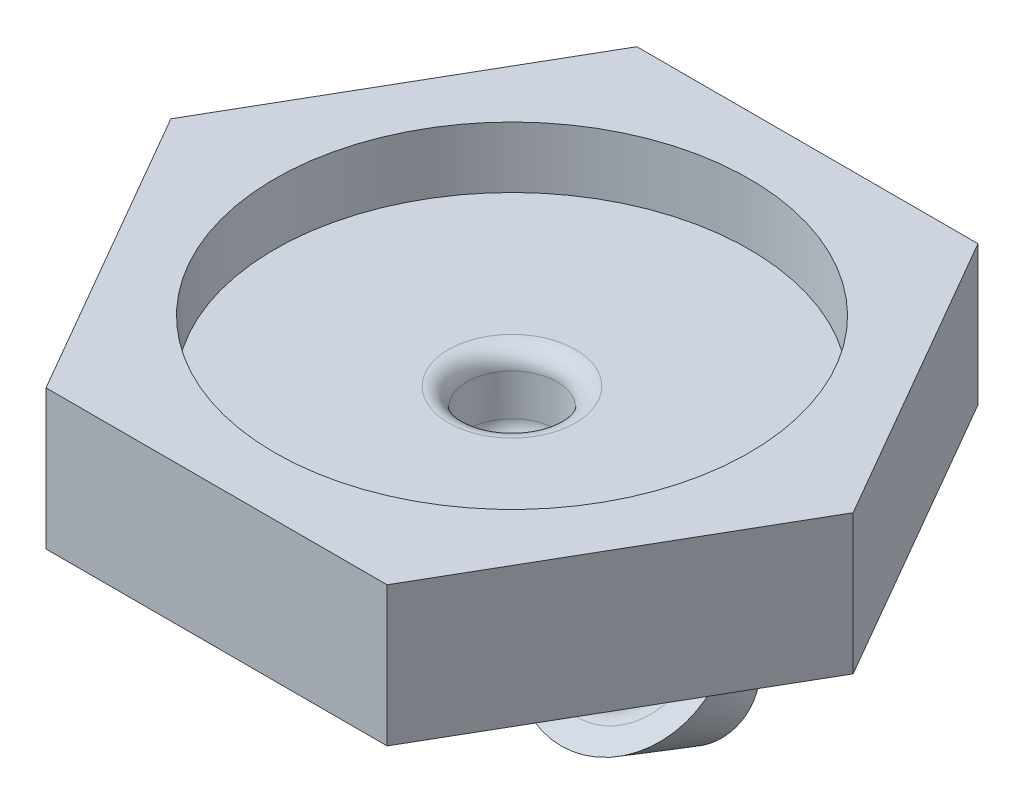
ISO-10303-21;
HEADER;
FILE_DESCRIPTION(('STEP AP214'),'2;1');
FILE_NAME('part.step','',(''),(''),'','','');
FILE_SCHEMA(('AUTOMOTIVE_DESIGN { 1 0 10303 214 1 1 1 1 }'));
ENDSEC;
DATA;
#1=APPLICATION_CONTEXT('core data for automotive mechanical design processes');
#2=APPLICATION_PROTOCOL_DEFINITION('international standard','automotive_design',2000,#1);
#3=PRODUCT_CONTEXT('',#1,'mechanical');
#4=PRODUCT('Part','Part','',(#3));
#5=PRODUCT_RELATED_PRODUCT_CATEGORY('part','',(#4));
#6=PRODUCT_DEFINITION_FORMATION('','',#4);
#7=PRODUCT_DEFINITION_CONTEXT('part definition',#1,'design');
#8=PRODUCT_DEFINITION('design','',#6,#7);
#9=PRODUCT_DEFINITION_SHAPE('','',#8);
#10=(LENGTH_UNIT() NAMED_UNIT(*) SI_UNIT(.MILLI.,.METRE.));
#11=(NAMED_UNIT(*) PLANE_ANGLE_UNIT() SI_UNIT($,.RADIAN.));
#12=(NAMED_UNIT(*) SI_UNIT($,.STERADIAN.) SOLID_ANGLE_UNIT());
#13=UNCERTAINTY_MEASURE_WITH_UNIT(LENGTH_MEASURE(1.E-05),#10,'distance_accuracy_value','');
#14=(GEOMETRIC_REPRESENTATION_CONTEXT(3) GLOBAL_UNCERTAINTY_ASSIGNED_CONTEXT((#13)) GLOBAL_UNIT_ASSIGNED_CONTEXT((#10,
#11,#12)) REPRESENTATION_CONTEXT('',''));
#15=CARTESIAN_POINT('',(0.,0.,0.));
#16=DIRECTION('',(0.,0.,1.));
#17=DIRECTION('',(1.,0.,0.));
#18=AXIS2_PLACEMENT_3D('',#15,#16,#17);
#19=CARTESIAN_POINT('',(0.,3.22,0.));
#20=DIRECTION('',(0.,1.,0.));
#21=DIRECTION('',(0.,0.,1.));
#22=AXIS2_PLACEMENT_3D('',#19,#20,#21);
#23=TOROIDAL_SURFACE('',#22,3.415,1.);
#24=CARTESIAN_POINT('',(0.,4.22,0.));
#25=DIRECTION('',(0.,1.,0.));
#26=DIRECTION('',(0.,0.,1.));
#27=AXIS2_PLACEMENT_3D('',#24,#25,#26);
#28=CIRCLE('',#27,3.415);
#29=CARTESIAN_POINT('',(0.,4.22,3.415));
#30=VERTEX_POINT('',#29);
#31=EDGE_CURVE('E48',#30,#30,#28,.F.);
#32=ORIENTED_EDGE('',*,*,#31,.F.);
#33=EDGE_LOOP('',(#32));
#34=FACE_BOUND('',#33,.T.);
#35=CARTESIAN_POINT('',(0.,3.22,0.));
#36=DIRECTION('',(0.,1.,0.));
#37=DIRECTION('',(0.,0.,1.));
#38=AXIS2_PLACEMENT_3D('',#35,#36,#37);
#39=CIRCLE('',#38,2.415);
#40=CARTESIAN_POINT('',(0.,3.22,2.415));
#41=VERTEX_POINT('',#40);
#42=EDGE_CURVE('E11',#41,#41,#39,.T.);
#43=ORIENTED_EDGE('',*,*,#42,.F.);
#44=EDGE_LOOP('',(#43));
#45=FACE_BOUND('',#44,.T.);
#46=ADVANCED_FACE('F39',(#34,#45),#23,.T.);
#47=CARTESIAN_POINT('',(0.,1.,0.));
#48=DIRECTION('',(0.,-1.,0.));
#49=DIRECTION('',(0.,0.,-1.));
#50=AXIS2_PLACEMENT_3D('',#47,#48,#49);
#51=TOROIDAL_SURFACE('',#50,1.415,1.);
#52=CARTESIAN_POINT('',(0.,1.,0.));
#53=DIRECTION('',(0.,-1.,0.));
#54=DIRECTION('',(0.,0.,-1.));
#55=AXIS2_PLACEMENT_3D('',#52,#53,#54);
#56=CIRCLE('',#55,2.415);
#57=CARTESIAN_POINT('',(0.,1.,-2.415));
#58=VERTEX_POINT('',#57);
#59=EDGE_CURVE('E172',#58,#58,#56,.T.);
#60=ORIENTED_EDGE('',*,*,#59,.F.);
#61=EDGE_LOOP('',(#60));
#62=FACE_BOUND('',#61,.T.);
#63=CARTESIAN_POINT('',(0.,0.,0.));
#64=DIRECTION('',(0.,-1.,0.));
#65=DIRECTION('',(0.,0.,-1.));
#66=AXIS2_PLACEMENT_3D('',#63,#64,#65);
#67=CIRCLE('',#66,1.415);
#68=CARTESIAN_POINT('',(0.,0.,-1.415));
#69=VERTEX_POINT('',#68);
#70=EDGE_CURVE('E176',#69,#69,#67,.F.);
#71=ORIENTED_EDGE('',*,*,#70,.F.);
#72=EDGE_LOOP('',(#71));
#73=FACE_BOUND('',#72,.T.);
#74=ADVANCED_FACE('F188',(#62,#73),#51,.F.);
#75=CARTESIAN_POINT('',(0.,-9.77817459305202,-5.29289321881346));
#76=DIRECTION('',(0.,0.707106781186546,0.707106781186549));
#77=DIRECTION('',(0.,-0.707106781186549,0.707106781186546));
#78=AXIS2_PLACEMENT_3D('',#75,#76,#77);
#79=TOROIDAL_SURFACE('',#78,3.5,1.);
#80=CARTESIAN_POINT('',(0.,-10.4852813742386,-6.00000000000001));
#81=DIRECTION('',(0.,0.707106781186546,0.707106781186549));
#82=DIRECTION('',(0.,-0.707106781186549,0.707106781186546));
#83=AXIS2_PLACEMENT_3D('',#80,#81,#82);
#84=CIRCLE('',#83,3.5);
#85=CARTESIAN_POINT('',(0.,-12.9601551083915,-3.5251262658471));
#86=VERTEX_POINT('',#85);
#87=EDGE_CURVE('E164',#86,#86,#84,.F.);
#88=ORIENTED_EDGE('',*,*,#87,.F.);
#89=EDGE_LOOP('',(#88));
#90=FACE_BOUND('',#89,.T.);
#91=CARTESIAN_POINT('',(0.,-9.77817459305202,-5.29289321881346));
#92=DIRECTION('',(0.,0.707106781186546,0.707106781186549));
#93=DIRECTION('',(0.,-0.707106781186549,0.707106781186546));
#94=AXIS2_PLACEMENT_3D('',#91,#92,#93);
#95=CIRCLE('',#94,2.5);
#96=CARTESIAN_POINT('',(0.,-11.5459415460184,-3.5251262658471));
#97=VERTEX_POINT('',#96);
#98=EDGE_CURVE('E168',#97,#97,#95,.T.);
#99=ORIENTED_EDGE('',*,*,#98,.F.);
#100=EDGE_LOOP('',(#99));
#101=FACE_BOUND('',#100,.T.);
#102=ADVANCED_FACE('F200',(#90,#101),#79,.F.);
#103=CARTESIAN_POINT('',(0.,-2.,0.));
#104=DIRECTION('',(0.,1.,0.));
#105=DIRECTION('',(0.,0.,1.));
#106=AXIS2_PLACEMENT_3D('',#103,#104,#105);
#107=TOROIDAL_SURFACE('',#106,4.5,2.);
#108=CARTESIAN_POINT('',(0.,0.,0.));
#109=DIRECTION('',(0.,1.,0.));
#110=DIRECTION('',(0.,0.,1.));
#111=AXIS2_PLACEMENT_3D('',#108,#109,#110);
#112=CIRCLE('',#111,4.5);
#113=CARTESIAN_POINT('',(0.,0.,4.5));
#114=VERTEX_POINT('',#113);
#115=EDGE_CURVE('E160',#114,#114,#112,.T.);
#116=ORIENTED_EDGE('',*,*,#115,.F.);
#117=EDGE_LOOP('',(#116));
#118=FACE_BOUND('',#117,.T.);
#119=CARTESIAN_POINT('',(0.,-2.,0.));
#120=DIRECTION('',(0.,-1.,0.));
#121=DIRECTION('',(0.,0.,-1.));
#122=AXIS2_PLACEMENT_3D('',#119,#120,#121);
#123=CIRCLE('',#122,2.5);
#124=CARTESIAN_POINT('',(0.,-2.,2.5));
#125=VERTEX_POINT('',#124);
#126=EDGE_CURVE('E222',#125,#125,#123,.T.);
#127=ORIENTED_EDGE('',*,*,#126,.F.);
#128=EDGE_LOOP('',(#127));
#129=FACE_BOUND('',#128,.T.);
#130=ADVANCED_FACE('F280',(#118,#129),#107,.F.);
#131=CARTESIAN_POINT('',(9.16543552338531,7.5,15.875));
#132=DIRECTION('',(-0.866025403784439,0.,-0.5));
#133=DIRECTION('',(-0.5,0.,0.866025403784439));
#134=AXIS2_PLACEMENT_3D('',#131,#132,#133);
#135=PLANE('',#134);
#136=DIRECTION('',(0.5,0.,-0.866025403784439));
#137=VECTOR('',#136,1.);
#138=CARTESIAN_POINT('',(9.16543552338531,0.,15.875));
#139=LINE('',#138,#137);
#140=CARTESIAN_POINT('',(9.16543552338531,0.,15.875));
#141=VERTEX_POINT('',#140);
#142=CARTESIAN_POINT('',(18.3308710467706,0.,0.));
#143=VERTEX_POINT('',#142);
#144=EDGE_CURVE('E129',#141,#143,#139,.T.);
#145=ORIENTED_EDGE('',*,*,#144,.T.);
#146=DIRECTION('',(0.,-1.,0.));
#147=VECTOR('',#146,1.);
#148=CARTESIAN_POINT('',(18.3308710467706,7.5,0.));
#149=LINE('',#148,#147);
#150=CARTESIAN_POINT('',(18.3308710467706,7.5,0.));
#151=VERTEX_POINT('',#150);
#152=EDGE_CURVE('E157',#151,#143,#149,.T.);
#153=ORIENTED_EDGE('',*,*,#152,.F.);
#154=DIRECTION('',(0.5,0.,-0.866025403784439));
#155=VECTOR('',#154,1.);
#156=CARTESIAN_POINT('',(9.16543552338531,7.5,15.875));
#157=LINE('',#156,#155);
#158=CARTESIAN_POINT('',(9.16543552338531,7.5,15.875));
#159=VERTEX_POINT('',#158);
#160=EDGE_CURVE('E146',#159,#151,#157,.T.);
#161=ORIENTED_EDGE('',*,*,#160,.F.);
#162=DIRECTION('',(0.,-1.,0.));
#163=VECTOR('',#162,1.);
#164=CARTESIAN_POINT('',(9.16543552338531,7.5,15.875));
#165=LINE('',#164,#163);
#166=EDGE_CURVE('E125',#159,#141,#165,.T.);
#167=ORIENTED_EDGE('',*,*,#166,.T.);
#168=EDGE_LOOP('',(#145,#153,#161,#167));
#169=FACE_BOUND('',#168,.T.);
#170=ADVANCED_FACE('F259',(#169),#135,.F.);
#171=CARTESIAN_POINT('',(18.3308710467706,7.5,0.));
#172=DIRECTION('',(-0.866025403784439,0.,0.5));
#173=DIRECTION('',(0.5,0.,0.866025403784439));
#174=AXIS2_PLACEMENT_3D('',#171,#172,#173);
#175=PLANE('',#174);
#176=DIRECTION('',(-0.5,0.,-0.866025403784439));
#177=VECTOR('',#176,1.);
#178=CARTESIAN_POINT('',(18.3308710467706,0.,0.));
#179=LINE('',#178,#177);
#180=CARTESIAN_POINT('',(9.1654355233853,0.,-15.875));
#181=VERTEX_POINT('',#180);
#182=EDGE_CURVE('E133',#143,#181,#179,.T.);
#183=ORIENTED_EDGE('',*,*,#182,.T.);
#184=DIRECTION('',(0.,-1.,0.));
#185=VECTOR('',#184,1.);
#186=CARTESIAN_POINT('',(9.1654355233853,7.5,-15.875));
#187=LINE('',#186,#185);
#188=CARTESIAN_POINT('',(9.1654355233853,7.5,-15.875));
#189=VERTEX_POINT('',#188);
#190=EDGE_CURVE('E153',#189,#181,#187,.T.);
#191=ORIENTED_EDGE('',*,*,#190,.F.);
#192=DIRECTION('',(-0.5,0.,-0.866025403784439));
#193=VECTOR('',#192,1.);
#194=CARTESIAN_POINT('',(18.3308710467706,7.5,0.));
#195=LINE('',#194,#193);
#196=EDGE_CURVE('E94',#151,#189,#195,.T.);
#197=ORIENTED_EDGE('',*,*,#196,.F.);
#198=ORIENTED_EDGE('',*,*,#152,.T.);
#199=EDGE_LOOP('',(#183,#191,#197,#198));
#200=FACE_BOUND('',#199,.T.);
#201=ADVANCED_FACE('F251',(#200),#175,.F.);
#202=CARTESIAN_POINT('',(9.1654355233853,7.5,-15.875));
#203=DIRECTION('',(0.,0.,1.));
#204=DIRECTION('',(1.,0.,0.));
#205=AXIS2_PLACEMENT_3D('',#202,#203,#204);
#206=PLANE('',#205);
#207=DIRECTION('',(-1.,0.,0.));
#208=VECTOR('',#207,1.);
#209=CARTESIAN_POINT('',(9.1654355233853,0.,-15.875));
#210=LINE('',#209,#208);
#211=CARTESIAN_POINT('',(-9.16543552338531,0.,-15.875));
#212=VERTEX_POINT('',#211);
#213=EDGE_CURVE('E137',#181,#212,#210,.T.);
#214=ORIENTED_EDGE('',*,*,#213,.T.);
#215=DIRECTION('',(0.,-1.,0.));
#216=VECTOR('',#215,1.);
#217=CARTESIAN_POINT('',(-9.16543552338531,7.5,-15.875));
#218=LINE('',#217,#216);
#219=CARTESIAN_POINT('',(-9.16543552338531,7.5,-15.875));
#220=VERTEX_POINT('',#219);
#221=EDGE_CURVE('E118',#220,#212,#218,.T.);
#222=ORIENTED_EDGE('',*,*,#221,.F.);
#223=DIRECTION('',(-1.,0.,0.));
#224=VECTOR('',#223,1.);
#225=CARTESIAN_POINT('',(9.1654355233853,7.5,-15.875));
#226=LINE('',#225,#224);
#227=EDGE_CURVE('E107',#189,#220,#226,.T.);
#228=ORIENTED_EDGE('',*,*,#227,.F.);
#229=ORIENTED_EDGE('',*,*,#190,.T.);
#230=EDGE_LOOP('',(#214,#222,#228,#229));
#231=FACE_BOUND('',#230,.T.);
#232=ADVANCED_FACE('F254',(#231),#206,.F.);
#233=CARTESIAN_POINT('',(-9.16543552338531,7.5,-15.875));
#234=DIRECTION('',(0.866025403784439,0.,0.5));
#235=DIRECTION('',(0.5,0.,-0.866025403784439));
#236=AXIS2_PLACEMENT_3D('',#233,#234,#235);
#237=PLANE('',#236);
#238=DIRECTION('',(-0.5,0.,0.866025403784439));
#239=VECTOR('',#238,1.);
#240=CARTESIAN_POINT('',(-9.16543552338531,0.,-15.875));
#241=LINE('',#240,#239);
#242=CARTESIAN_POINT('',(-18.3308710467706,0.,0.));
#243=VERTEX_POINT('',#242);
#244=EDGE_CURVE('E116',#212,#243,#241,.T.);
#245=ORIENTED_EDGE('',*,*,#244,.T.);
#246=DIRECTION('',(0.,-1.,0.));
#247=VECTOR('',#246,1.);
#248=CARTESIAN_POINT('',(-18.3308710467706,7.5,0.));
#249=LINE('',#248,#247);
#250=CARTESIAN_POINT('',(-18.3308710467706,7.5,0.));
#251=VERTEX_POINT('',#250);
#252=EDGE_CURVE('E113',#251,#243,#249,.T.);
#253=ORIENTED_EDGE('',*,*,#252,.F.);
#254=DIRECTION('',(-0.5,0.,0.866025403784439));
#255=VECTOR('',#254,1.);
#256=CARTESIAN_POINT('',(-9.16543552338531,7.5,-15.875));
#257=LINE('',#256,#255);
#258=EDGE_CURVE('E101',#220,#251,#257,.T.);
#259=ORIENTED_EDGE('',*,*,#258,.F.);
#260=ORIENTED_EDGE('',*,*,#221,.T.);
#261=EDGE_LOOP('',(#245,#253,#259,#260));
#262=FACE_BOUND('',#261,.T.);
#263=ADVANCED_FACE('F114',(#262),#237,.F.);
#264=CARTESIAN_POINT('',(-18.3308710467706,7.5,0.));
#265=DIRECTION('',(0.866025403784439,0.,-0.5));
#266=DIRECTION('',(-0.5,0.,-0.866025403784439));
#267=AXIS2_PLACEMENT_3D('',#264,#265,#266);
#268=PLANE('',#267);
#269=DIRECTION('',(0.5,0.,0.866025403784439));
#270=VECTOR('',#269,1.);
#271=CARTESIAN_POINT('',(-18.3308710467706,0.,0.));
#272=LINE('',#271,#270);
#273=CARTESIAN_POINT('',(-9.16543552338531,0.,15.875));
#274=VERTEX_POINT('',#273);
#275=EDGE_CURVE('E79',#243,#274,#272,.T.);
#276=ORIENTED_EDGE('',*,*,#275,.T.);
#277=DIRECTION('',(0.,-1.,0.));
#278=VECTOR('',#277,1.);
#279=CARTESIAN_POINT('',(-9.16543552338531,7.5,15.875));
#280=LINE('',#279,#278);
#281=CARTESIAN_POINT('',(-9.16543552338531,7.5,15.875));
#282=VERTEX_POINT('',#281);
#283=EDGE_CURVE('E119',#282,#274,#280,.T.);
#284=ORIENTED_EDGE('',*,*,#283,.F.);
#285=DIRECTION('',(0.5,0.,0.866025403784439));
#286=VECTOR('',#285,1.);
#287=CARTESIAN_POINT('',(-18.3308710467706,7.5,0.));
#288=LINE('',#287,#286);
#289=EDGE_CURVE('E105',#251,#282,#288,.T.);
#290=ORIENTED_EDGE('',*,*,#289,.F.);
#291=ORIENTED_EDGE('',*,*,#252,.T.);
#292=EDGE_LOOP('',(#276,#284,#290,#291));
#293=FACE_BOUND('',#292,.T.);
#294=ADVANCED_FACE('F121',(#293),#268,.F.);
#295=CARTESIAN_POINT('',(-9.16543552338531,7.5,15.875));
#296=DIRECTION('',(0.,0.,-1.));
#297=DIRECTION('',(-1.,0.,0.));
#298=AXIS2_PLACEMENT_3D('',#295,#296,#297);
#299=PLANE('',#298);
#300=DIRECTION('',(1.,0.,0.));
#301=VECTOR('',#300,1.);
#302=CARTESIAN_POINT('',(-9.16543552338531,0.,15.875));
#303=LINE('',#302,#301);
#304=EDGE_CURVE('E85',#274,#141,#303,.T.);
#305=ORIENTED_EDGE('',*,*,#304,.T.);
#306=ORIENTED_EDGE('',*,*,#166,.F.);
#307=DIRECTION('',(1.,0.,0.));
#308=VECTOR('',#307,1.);
#309=CARTESIAN_POINT('',(-9.16543552338531,7.5,15.875));
#310=LINE('',#309,#308);
#311=EDGE_CURVE('E56',#282,#159,#310,.T.);
#312=ORIENTED_EDGE('',*,*,#311,.F.);
#313=ORIENTED_EDGE('',*,*,#283,.T.);
#314=EDGE_LOOP('',(#305,#306,#312,#313));
#315=FACE_BOUND('',#314,.T.);
#316=ADVANCED_FACE('F260',(#315),#299,.F.);
#317=CARTESIAN_POINT('',(0.,7.5,0.));
#318=DIRECTION('',(0.,1.,0.));
#319=DIRECTION('',(0.,0.,1.));
#320=AXIS2_PLACEMENT_3D('',#317,#318,#319);
#321=PLANE('',#320);
#322=CARTESIAN_POINT('',(0.,7.5,0.));
#323=DIRECTION('',(0.,1.,0.));
#324=DIRECTION('',(0.,0.,1.));
#325=AXIS2_PLACEMENT_3D('',#322,#323,#324);
#326=CIRCLE('',#325,12.75);
#327=CARTESIAN_POINT('',(0.,7.5,12.75));
#328=VERTEX_POINT('',#327);
#329=EDGE_CURVE('E235',#328,#328,#326,.T.);
#330=ORIENTED_EDGE('',*,*,#329,.F.);
#331=EDGE_LOOP('',(#330));
#332=FACE_BOUND('',#331,.T.);
#333=ORIENTED_EDGE('',*,*,#160,.T.);
#334=ORIENTED_EDGE('',*,*,#196,.T.);
#335=ORIENTED_EDGE('',*,*,#227,.T.);
#336=ORIENTED_EDGE('',*,*,#258,.T.);
#337=ORIENTED_EDGE('',*,*,#289,.T.);
#338=ORIENTED_EDGE('',*,*,#311,.T.);
#339=EDGE_LOOP('',(#333,#334,#335,#336,#337,#338));
#340=FACE_BOUND('',#339,.T.);
#341=ADVANCED_FACE('F103',(#332,#340),#321,.T.);
#342=CARTESIAN_POINT('',(0.,0.,0.));
#343=DIRECTION('',(0.,1.,0.));
#344=DIRECTION('',(0.,0.,1.));
#345=AXIS2_PLACEMENT_3D('',#342,#343,#344);
#346=PLANE('',#345);
#347=ORIENTED_EDGE('',*,*,#115,.T.);
#348=EDGE_LOOP('',(#347));
#349=FACE_BOUND('',#348,.T.);
#350=ORIENTED_EDGE('',*,*,#144,.F.);
#351=ORIENTED_EDGE('',*,*,#304,.F.);
#352=ORIENTED_EDGE('',*,*,#275,.F.);
#353=ORIENTED_EDGE('',*,*,#244,.F.);
#354=ORIENTED_EDGE('',*,*,#213,.F.);
#355=ORIENTED_EDGE('',*,*,#182,.F.);
#356=EDGE_LOOP('',(#350,#351,#352,#353,#354,#355));
#357=FACE_BOUND('',#356,.T.);
#358=ADVANCED_FACE('F257',(#349,#357),#346,.F.);
#359=CARTESIAN_POINT('',(0.,4.22,0.));
#360=DIRECTION('',(0.,1.,0.));
#361=DIRECTION('',(0.,0.,1.));
#362=AXIS2_PLACEMENT_3D('',#359,#360,#361);
#363=CYLINDRICAL_SURFACE('',#362,12.75);
#364=CARTESIAN_POINT('',(0.,4.22,0.));
#365=DIRECTION('',(0.,1.,0.));
#366=DIRECTION('',(0.,0.,1.));
#367=AXIS2_PLACEMENT_3D('',#364,#365,#366);
#368=CIRCLE('',#367,12.75);
#369=CARTESIAN_POINT('',(0.,4.22,12.75));
#370=VERTEX_POINT('',#369);
#371=EDGE_CURVE('E134',#370,#370,#368,.T.);
#372=ORIENTED_EDGE('',*,*,#371,.F.);
#373=EDGE_LOOP('',(#372));
#374=FACE_BOUND('',#373,.T.);
#375=ORIENTED_EDGE('',*,*,#329,.T.);
#376=EDGE_LOOP('',(#375));
#377=FACE_BOUND('',#376,.T.);
#378=ADVANCED_FACE('F381',(#374,#377),#363,.F.);
#379=CARTESIAN_POINT('',(0.,4.22,0.));
#380=DIRECTION('',(0.,1.,0.));
#381=DIRECTION('',(0.,0.,1.));
#382=AXIS2_PLACEMENT_3D('',#379,#380,#381);
#383=PLANE('',#382);
#384=ORIENTED_EDGE('',*,*,#31,.T.);
#385=EDGE_LOOP('',(#384));
#386=FACE_BOUND('',#385,.T.);
#387=ORIENTED_EDGE('',*,*,#371,.T.);
#388=EDGE_LOOP('',(#387));
#389=FACE_BOUND('',#388,.T.);
#390=ADVANCED_FACE('F183',(#386,#389),#383,.T.);
#391=CARTESIAN_POINT('',(0.,-0.00100000000000013,0.));
#392=DIRECTION('',(0.,1.,0.));
#393=DIRECTION('',(0.,0.,1.));
#394=AXIS2_PLACEMENT_3D('',#391,#392,#393);
#395=CYLINDRICAL_SURFACE('',#394,2.415);
#396=ORIENTED_EDGE('',*,*,#42,.T.);
#397=EDGE_LOOP('',(#396));
#398=FACE_BOUND('',#397,.T.);
#399=ORIENTED_EDGE('',*,*,#59,.T.);
#400=EDGE_LOOP('',(#399));
#401=FACE_BOUND('',#400,.T.);
#402=ADVANCED_FACE('F191',(#398,#401),#395,.F.);
#403=CARTESIAN_POINT('',(0.,0.,0.));
#404=DIRECTION('',(0.,-1.,0.));
#405=DIRECTION('',(0.,0.,-1.));
#406=AXIS2_PLACEMENT_3D('',#403,#404,#405);
#407=PLANE('',#406);
#408=ORIENTED_EDGE('',*,*,#70,.T.);
#409=EDGE_LOOP('',(#408));
#410=FACE_BOUND('',#409,.T.);
#411=CARTESIAN_POINT('',(0.,0.,0.));
#412=DIRECTION('',(0.,-1.,0.));
#413=DIRECTION('',(0.,0.,-1.));
#414=AXIS2_PLACEMENT_3D('',#411,#412,#413);
#415=CIRCLE('',#414,1.125);
#416=CARTESIAN_POINT('',(0.,0.,-1.125));
#417=VERTEX_POINT('',#416);
#418=EDGE_CURVE('E210',#417,#417,#415,.F.);
#419=ORIENTED_EDGE('',*,*,#418,.F.);
#420=EDGE_LOOP('',(#419));
#421=FACE_BOUND('',#420,.T.);
#422=ADVANCED_FACE('F194',(#410,#421),#407,.F.);
#423=CARTESIAN_POINT('',(0.,-2.,-6.));
#424=DIRECTION('',(1.,0.,0.));
#425=DIRECTION('',(0.,0.,-1.));
#426=AXIS2_PLACEMENT_3D('',#423,#424,#425);
#427=TOROIDAL_SURFACE('',#426,6.,2.5);
#428=CARTESIAN_POINT('',(0.,-6.2426406871193,-1.75735931288073));
#429=DIRECTION('',(0.,-0.707106781186546,-0.707106781186549));
#430=DIRECTION('',(0.,0.707106781186549,-0.707106781186546));
#431=AXIS2_PLACEMENT_3D('',#428,#429,#430);
#432=CIRCLE('',#431,2.5);
#433=CARTESIAN_POINT('',(0.,-8.01040764008567,0.0104076400856369));
#434=VERTEX_POINT('',#433);
#435=EDGE_CURVE('E214',#434,#434,#432,.T.);
#436=CARTESIAN_POINT('',(0.,-2.,-6.));
#437=DIRECTION('',(1.,0.,0.));
#438=DIRECTION('',(0.,0.,-1.));
#439=AXIS2_PLACEMENT_3D('',#436,#437,#438);
#440=CIRCLE('',#439,8.5);
#441=EDGE_CURVE('',#125,#434,#440,.T.);
#442=ORIENTED_EDGE('',*,*,#126,.T.);
#443=ORIENTED_EDGE('',*,*,#435,.F.);
#444=ORIENTED_EDGE('',*,*,#441,.T.);
#445=ORIENTED_EDGE('',*,*,#441,.F.);
#446=EDGE_LOOP('',(#442,#444,#443,#445));
#447=FACE_BOUND('',#446,.T.);
#448=ADVANCED_FACE('F205',(#447),#427,.T.);
#449=CARTESIAN_POINT('',(0.,-6.2426406871193,-1.75735931288073));
#450=DIRECTION('',(0.,-0.707106781186546,-0.707106781186549));
#451=DIRECTION('',(0.,0.707106781186549,-0.707106781186546));
#452=AXIS2_PLACEMENT_3D('',#449,#450,#451);
#453=CYLINDRICAL_SURFACE('',#452,2.5);
#454=ORIENTED_EDGE('',*,*,#98,.T.);
#455=EDGE_LOOP('',(#454));
#456=FACE_BOUND('',#455,.T.);
#457=ORIENTED_EDGE('',*,*,#435,.T.);
#458=EDGE_LOOP('',(#457));
#459=FACE_BOUND('',#458,.T.);
#460=ADVANCED_FACE('F292',(#456,#459),#453,.T.);
#461=CARTESIAN_POINT('',(0.,-14.7279220613578,-10.2426406871193));
#462=DIRECTION('',(0.,-0.707106781186546,-0.707106781186549));
#463=DIRECTION('',(0.,0.707106781186549,-0.707106781186546));
#464=AXIS2_PLACEMENT_3D('',#461,#462,#463);
#465=PLANE('',#464);
#466=CARTESIAN_POINT('',(0.,-14.7279220613578,-10.2426406871193));
#467=DIRECTION('',(0.,-0.707106781186546,-0.707106781186549));
#468=DIRECTION('',(0.,0.707106781186549,-0.707106781186546));
#469=AXIS2_PLACEMENT_3D('',#466,#467,#468);
#470=CIRCLE('',#469,1.125);
#471=CARTESIAN_POINT('',(0.,-13.932426932523,-11.0381358159542));
#472=VERTEX_POINT('',#471);
#473=EDGE_CURVE('E231',#472,#472,#470,.F.);
#474=ORIENTED_EDGE('',*,*,#473,.T.);
#475=EDGE_LOOP('',(#474));
#476=FACE_BOUND('',#475,.T.);
#477=CARTESIAN_POINT('',(0.,-14.7279220613578,-10.2426406871193));
#478=DIRECTION('',(0.,0.707106781186546,0.707106781186549));
#479=DIRECTION('',(0.,-0.707106781186549,0.707106781186546));
#480=AXIS2_PLACEMENT_3D('',#477,#478,#479);
#481=CIRCLE('',#480,2.5);
#482=CARTESIAN_POINT('',(0.,-16.4956890143242,-8.47487373415294));
#483=VERTEX_POINT('',#482);
#484=EDGE_CURVE('E337',#483,#483,#481,.T.);
#485=ORIENTED_EDGE('',*,*,#484,.F.);
#486=EDGE_LOOP('',(#485));
#487=FACE_BOUND('',#486,.T.);
#488=ADVANCED_FACE('F295',(#476,#487),#465,.T.);
#489=CARTESIAN_POINT('',(0.,0.,0.));
#490=DIRECTION('',(0.,-1.,0.));
#491=DIRECTION('',(0.,0.,-1.));
#492=AXIS2_PLACEMENT_3D('',#489,#490,#491);
#493=CYLINDRICAL_SURFACE('',#492,1.125);
#494=CARTESIAN_POINT('',(0.,-2.,0.));
#495=DIRECTION('',(0.,-1.,0.));
#496=DIRECTION('',(0.,0.,-1.));
#497=AXIS2_PLACEMENT_3D('',#494,#495,#496);
#498=CIRCLE('',#497,1.125);
#499=CARTESIAN_POINT('',(0.,-2.,1.125));
#500=VERTEX_POINT('',#499);
#501=EDGE_CURVE('E213',#500,#500,#498,.F.);
#502=ORIENTED_EDGE('',*,*,#501,.F.);
#503=EDGE_LOOP('',(#502));
#504=FACE_BOUND('',#503,.T.);
#505=ORIENTED_EDGE('',*,*,#418,.T.);
#506=EDGE_LOOP('',(#505));
#507=FACE_BOUND('',#506,.T.);
#508=ADVANCED_FACE('F323',(#504,#507),#493,.F.);
#509=CARTESIAN_POINT('',(0.,-2.,-6.));
#510=DIRECTION('',(1.,0.,0.));
#511=DIRECTION('',(0.,0.,-1.));
#512=AXIS2_PLACEMENT_3D('',#509,#510,#511);
#513=TOROIDAL_SURFACE('',#512,6.,1.125);
#514=CARTESIAN_POINT('',(0.,-6.2426406871193,-1.75735931288073));
#515=DIRECTION('',(0.,-0.707106781186546,-0.707106781186549));
#516=DIRECTION('',(0.,0.707106781186549,-0.707106781186546));
#517=AXIS2_PLACEMENT_3D('',#514,#515,#516);
#518=CIRCLE('',#517,1.125);
#519=CARTESIAN_POINT('',(0.,-7.03813581595416,-0.961864184045862));
#520=VERTEX_POINT('',#519);
#521=EDGE_CURVE('E219',#520,#520,#518,.F.);
#522=CARTESIAN_POINT('',(0.,-2.,-6.));
#523=DIRECTION('',(1.,0.,0.));
#524=DIRECTION('',(0.,0.,-1.));
#525=AXIS2_PLACEMENT_3D('',#522,#523,#524);
#526=CIRCLE('',#525,7.125);
#527=EDGE_CURVE('',#500,#520,#526,.T.);
#528=ORIENTED_EDGE('',*,*,#501,.T.);
#529=ORIENTED_EDGE('',*,*,#521,.F.);
#530=ORIENTED_EDGE('',*,*,#527,.T.);
#531=ORIENTED_EDGE('',*,*,#527,.F.);
#532=EDGE_LOOP('',(#528,#530,#529,#531));
#533=FACE_BOUND('',#532,.T.);
#534=ADVANCED_FACE('F317',(#533),#513,.F.);
#535=CARTESIAN_POINT('',(0.,-6.2426406871193,-1.75735931288073));
#536=DIRECTION('',(0.,-0.707106781186546,-0.707106781186549));
#537=DIRECTION('',(0.,0.707106781186549,-0.707106781186546));
#538=AXIS2_PLACEMENT_3D('',#535,#536,#537);
#539=CYLINDRICAL_SURFACE('',#538,1.125);
#540=ORIENTED_EDGE('',*,*,#473,.F.);
#541=EDGE_LOOP('',(#540));
#542=FACE_BOUND('',#541,.T.);
#543=ORIENTED_EDGE('',*,*,#521,.T.);
#544=EDGE_LOOP('',(#543));
#545=FACE_BOUND('',#544,.T.);
#546=ADVANCED_FACE('F207',(#542,#545),#539,.F.);
#547=CARTESIAN_POINT('',(0.,-10.4852813742386,-6.00000000000001));
#548=DIRECTION('',(0.,0.707106781186546,0.707106781186549));
#549=DIRECTION('',(0.,-0.707106781186549,0.707106781186546));
#550=AXIS2_PLACEMENT_3D('',#547,#548,#549);
#551=CONICAL_SURFACE('',#550,4.75,0.358770670270572);
#552=ORIENTED_EDGE('',*,*,#484,.T.);
#553=EDGE_LOOP('',(#552));
#554=FACE_BOUND('',#553,.T.);
#555=CARTESIAN_POINT('',(0.,-10.4852813742386,-6.00000000000001));
#556=DIRECTION('',(0.,0.707106781186546,0.707106781186549));
#557=DIRECTION('',(0.,-0.707106781186549,0.707106781186546));
#558=AXIS2_PLACEMENT_3D('',#555,#556,#557);
#559=CIRCLE('',#558,4.75);
#560=CARTESIAN_POINT('',(0.,-13.8440385848747,-2.64124278936392));
#561=VERTEX_POINT('',#560);
#562=EDGE_CURVE('E225',#561,#561,#559,.T.);
#563=ORIENTED_EDGE('',*,*,#562,.F.);
#564=EDGE_LOOP('',(#563));
#565=FACE_BOUND('',#564,.T.);
#566=ADVANCED_FACE('F302',(#554,#565),#551,.T.);
#567=CARTESIAN_POINT('',(0.,-8.7175144212722,-7.76776695296638));
#568=DIRECTION('',(0.,0.707106781186546,0.707106781186549));
#569=DIRECTION('',(0.,-0.707106781186549,0.707106781186546));
#570=AXIS2_PLACEMENT_3D('',#567,#568,#569);
#571=PLANE('',#570);
#572=ORIENTED_EDGE('',*,*,#87,.T.);
#573=EDGE_LOOP('',(#572));
#574=FACE_BOUND('',#573,.T.);
#575=ORIENTED_EDGE('',*,*,#562,.T.);
#576=EDGE_LOOP('',(#575));
#577=FACE_BOUND('',#576,.T.);
#578=ADVANCED_FACE('F308',(#574,#577),#571,.T.);
#579=CLOSED_SHELL('',(#46,#74,#102,#130,#170,#201,#232,#263,#294,#316,#341,#358,#378,#390,#402,
#422,#448,#460,#488,#508,#534,#546,#566,#578));
#580=MANIFOLD_SOLID_BREP('B2',#579);
#581=ADVANCED_BREP_SHAPE_REPRESENTATION('',(#18,#580),#14);
#582=SHAPE_DEFINITION_REPRESENTATION(#9,#581);
ENDSEC;
END-ISO-10303-21;
